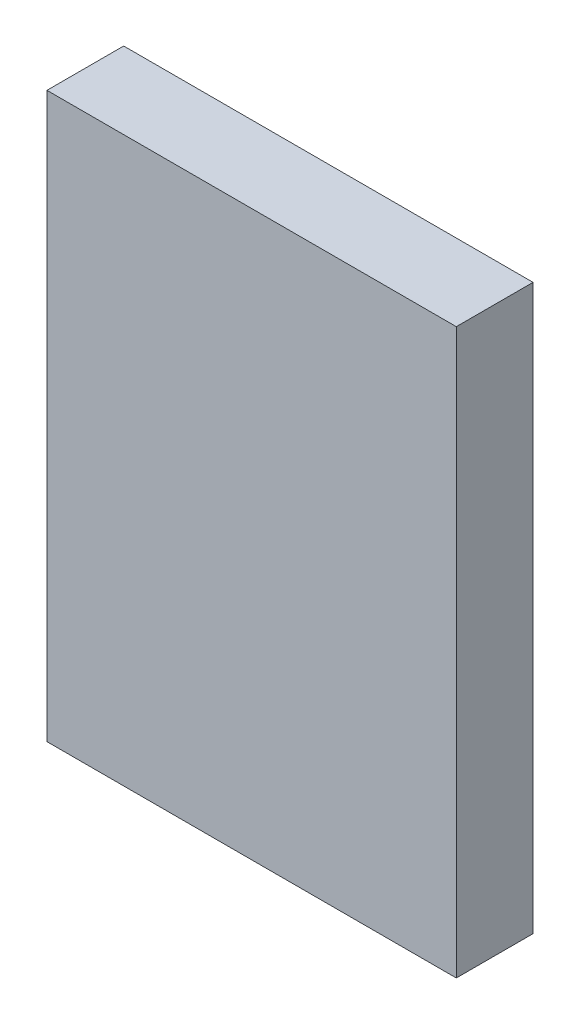
ISO-10303-21;
HEADER;
FILE_DESCRIPTION(('STEP AP214'),'2;1');
FILE_NAME('part.step','',(''),(''),'','','');
FILE_SCHEMA(('AUTOMOTIVE_DESIGN { 1 0 10303 214 1 1 1 1 }'));
ENDSEC;
DATA;
#1=APPLICATION_CONTEXT('core data for automotive mechanical design processes');
#2=APPLICATION_PROTOCOL_DEFINITION('international standard','automotive_design',2000,#1);
#3=PRODUCT_CONTEXT('',#1,'mechanical');
#4=PRODUCT('Part','Part','',(#3));
#5=PRODUCT_RELATED_PRODUCT_CATEGORY('part','',(#4));
#6=PRODUCT_DEFINITION_FORMATION('','',#4);
#7=PRODUCT_DEFINITION_CONTEXT('part definition',#1,'design');
#8=PRODUCT_DEFINITION('design','',#6,#7);
#9=PRODUCT_DEFINITION_SHAPE('','',#8);
#10=(LENGTH_UNIT() NAMED_UNIT(*) SI_UNIT(.MILLI.,.METRE.));
#11=(NAMED_UNIT(*) PLANE_ANGLE_UNIT() SI_UNIT($,.RADIAN.));
#12=(NAMED_UNIT(*) SI_UNIT($,.STERADIAN.) SOLID_ANGLE_UNIT());
#13=UNCERTAINTY_MEASURE_WITH_UNIT(LENGTH_MEASURE(1.E-05),#10,'distance_accuracy_value','');
#14=(GEOMETRIC_REPRESENTATION_CONTEXT(3) GLOBAL_UNCERTAINTY_ASSIGNED_CONTEXT((#13)) GLOBAL_UNIT_ASSIGNED_CONTEXT((#10,
#11,#12)) REPRESENTATION_CONTEXT('',''));
#15=CARTESIAN_POINT('',(0.,0.,0.));
#16=DIRECTION('',(0.,0.,1.));
#17=DIRECTION('',(1.,0.,0.));
#18=AXIS2_PLACEMENT_3D('',#15,#16,#17);
#19=CARTESIAN_POINT('',(-25.4,-35.,9.525));
#20=DIRECTION('',(1.,0.,0.));
#21=DIRECTION('',(0.,0.,-1.));
#22=AXIS2_PLACEMENT_3D('',#19,#20,#21);
#23=PLANE('',#22);
#24=DIRECTION('',(0.,-1.,0.));
#25=VECTOR('',#24,1.);
#26=CARTESIAN_POINT('',(-25.4,-35.,0.));
#27=LINE('',#26,#25);
#28=CARTESIAN_POINT('',(-25.4,35.,0.));
#29=VERTEX_POINT('',#28);
#30=CARTESIAN_POINT('',(-25.4,-35.,0.));
#31=VERTEX_POINT('',#30);
#32=EDGE_CURVE('E96',#29,#31,#27,.T.);
#33=ORIENTED_EDGE('',*,*,#32,.T.);
#34=DIRECTION('',(0.,0.,-1.));
#35=VECTOR('',#34,1.);
#36=CARTESIAN_POINT('',(-25.4,-35.,9.525));
#37=LINE('',#36,#35);
#38=CARTESIAN_POINT('',(-25.4,-35.,9.525));
#39=VERTEX_POINT('',#38);
#40=EDGE_CURVE('E11',#39,#31,#37,.T.);
#41=ORIENTED_EDGE('',*,*,#40,.F.);
#42=DIRECTION('',(0.,-1.,0.));
#43=VECTOR('',#42,1.);
#44=CARTESIAN_POINT('',(-25.4,-35.,9.525));
#45=LINE('',#44,#43);
#46=CARTESIAN_POINT('',(-25.4,35.,9.525));
#47=VERTEX_POINT('',#46);
#48=EDGE_CURVE('E84',#47,#39,#45,.T.);
#49=ORIENTED_EDGE('',*,*,#48,.F.);
#50=DIRECTION('',(0.,0.,-1.));
#51=VECTOR('',#50,1.);
#52=CARTESIAN_POINT('',(-25.4,35.,9.525));
#53=LINE('',#52,#51);
#54=EDGE_CURVE('E92',#47,#29,#53,.T.);
#55=ORIENTED_EDGE('',*,*,#54,.T.);
#56=EDGE_LOOP('',(#33,#41,#49,#55));
#57=FACE_BOUND('',#56,.T.);
#58=ADVANCED_FACE('F33',(#57),#23,.F.);
#59=CARTESIAN_POINT('',(25.4,-35.,9.525));
#60=DIRECTION('',(0.,1.,0.));
#61=DIRECTION('',(-1.,0.,0.));
#62=AXIS2_PLACEMENT_3D('',#59,#60,#61);
#63=PLANE('',#62);
#64=DIRECTION('',(1.,0.,0.));
#65=VECTOR('',#64,1.);
#66=CARTESIAN_POINT('',(25.4,-35.,0.));
#67=LINE('',#66,#65);
#68=CARTESIAN_POINT('',(25.4,-35.,0.));
#69=VERTEX_POINT('',#68);
#70=EDGE_CURVE('E88',#31,#69,#67,.T.);
#71=ORIENTED_EDGE('',*,*,#70,.T.);
#72=DIRECTION('',(0.,0.,-1.));
#73=VECTOR('',#72,1.);
#74=CARTESIAN_POINT('',(25.4,-35.,9.525));
#75=LINE('',#74,#73);
#76=CARTESIAN_POINT('',(25.4,-35.,9.525));
#77=VERTEX_POINT('',#76);
#78=EDGE_CURVE('E41',#77,#69,#75,.T.);
#79=ORIENTED_EDGE('',*,*,#78,.F.);
#80=DIRECTION('',(1.,0.,0.));
#81=VECTOR('',#80,1.);
#82=CARTESIAN_POINT('',(25.4,-35.,9.525));
#83=LINE('',#82,#81);
#84=EDGE_CURVE('E79',#39,#77,#83,.T.);
#85=ORIENTED_EDGE('',*,*,#84,.F.);
#86=ORIENTED_EDGE('',*,*,#40,.T.);
#87=EDGE_LOOP('',(#71,#79,#85,#86));
#88=FACE_BOUND('',#87,.T.);
#89=ADVANCED_FACE('F87',(#88),#63,.F.);
#90=CARTESIAN_POINT('',(25.4,-35.,9.525));
#91=DIRECTION('',(-1.,0.,0.));
#92=DIRECTION('',(0.,0.,1.));
#93=AXIS2_PLACEMENT_3D('',#90,#91,#92);
#94=PLANE('',#93);
#95=DIRECTION('',(0.,1.,0.));
#96=VECTOR('',#95,1.);
#97=CARTESIAN_POINT('',(25.4,-35.,0.));
#98=LINE('',#97,#96);
#99=CARTESIAN_POINT('',(25.4,35.,0.));
#100=VERTEX_POINT('',#99);
#101=EDGE_CURVE('E66',#69,#100,#98,.T.);
#102=ORIENTED_EDGE('',*,*,#101,.T.);
#103=DIRECTION('',(0.,0.,-1.));
#104=VECTOR('',#103,1.);
#105=CARTESIAN_POINT('',(25.4,35.,9.525));
#106=LINE('',#105,#104);
#107=CARTESIAN_POINT('',(25.4,35.,9.525));
#108=VERTEX_POINT('',#107);
#109=EDGE_CURVE('E89',#108,#100,#106,.T.);
#110=ORIENTED_EDGE('',*,*,#109,.F.);
#111=DIRECTION('',(0.,1.,0.));
#112=VECTOR('',#111,1.);
#113=CARTESIAN_POINT('',(25.4,-35.,9.525));
#114=LINE('',#113,#112);
#115=EDGE_CURVE('E82',#77,#108,#114,.T.);
#116=ORIENTED_EDGE('',*,*,#115,.F.);
#117=ORIENTED_EDGE('',*,*,#78,.T.);
#118=EDGE_LOOP('',(#102,#110,#116,#117));
#119=FACE_BOUND('',#118,.T.);
#120=ADVANCED_FACE('F90',(#119),#94,.F.);
#121=CARTESIAN_POINT('',(25.4,35.,9.525));
#122=DIRECTION('',(0.,-1.,0.));
#123=DIRECTION('',(0.,0.,-1.));
#124=AXIS2_PLACEMENT_3D('',#121,#122,#123);
#125=PLANE('',#124);
#126=DIRECTION('',(-1.,0.,0.));
#127=VECTOR('',#126,1.);
#128=CARTESIAN_POINT('',(25.4,35.,0.));
#129=LINE('',#128,#127);
#130=EDGE_CURVE('E72',#100,#29,#129,.T.);
#131=ORIENTED_EDGE('',*,*,#130,.T.);
#132=ORIENTED_EDGE('',*,*,#54,.F.);
#133=DIRECTION('',(-1.,0.,0.));
#134=VECTOR('',#133,1.);
#135=CARTESIAN_POINT('',(25.4,35.,9.525));
#136=LINE('',#135,#134);
#137=EDGE_CURVE('E49',#108,#47,#136,.T.);
#138=ORIENTED_EDGE('',*,*,#137,.F.);
#139=ORIENTED_EDGE('',*,*,#109,.T.);
#140=EDGE_LOOP('',(#131,#132,#138,#139));
#141=FACE_BOUND('',#140,.T.);
#142=ADVANCED_FACE('F103',(#141),#125,.F.);
#143=CARTESIAN_POINT('',(0.,0.,9.525));
#144=DIRECTION('',(0.,0.,1.));
#145=DIRECTION('',(1.,0.,0.));
#146=AXIS2_PLACEMENT_3D('',#143,#144,#145);
#147=PLANE('',#146);
#148=ORIENTED_EDGE('',*,*,#48,.T.);
#149=ORIENTED_EDGE('',*,*,#84,.T.);
#150=ORIENTED_EDGE('',*,*,#115,.T.);
#151=ORIENTED_EDGE('',*,*,#137,.T.);
#152=EDGE_LOOP('',(#148,#149,#150,#151));
#153=FACE_BOUND('',#152,.T.);
#154=ADVANCED_FACE('F80',(#153),#147,.T.);
#155=CARTESIAN_POINT('',(0.,0.,0.));
#156=DIRECTION('',(0.,0.,1.));
#157=DIRECTION('',(1.,0.,0.));
#158=AXIS2_PLACEMENT_3D('',#155,#156,#157);
#159=PLANE('',#158);
#160=ORIENTED_EDGE('',*,*,#32,.F.);
#161=ORIENTED_EDGE('',*,*,#130,.F.);
#162=ORIENTED_EDGE('',*,*,#101,.F.);
#163=ORIENTED_EDGE('',*,*,#70,.F.);
#164=EDGE_LOOP('',(#160,#161,#162,#163));
#165=FACE_BOUND('',#164,.T.);
#166=ADVANCED_FACE('F106',(#165),#159,.F.);
#167=CLOSED_SHELL('',(#58,#89,#120,#142,#154,#166));
#168=MANIFOLD_SOLID_BREP('B2',#167);
#169=ADVANCED_BREP_SHAPE_REPRESENTATION('',(#18,#168),#14);
#170=SHAPE_DEFINITION_REPRESENTATION(#9,#169);
ENDSEC;
END-ISO-10303-21;
